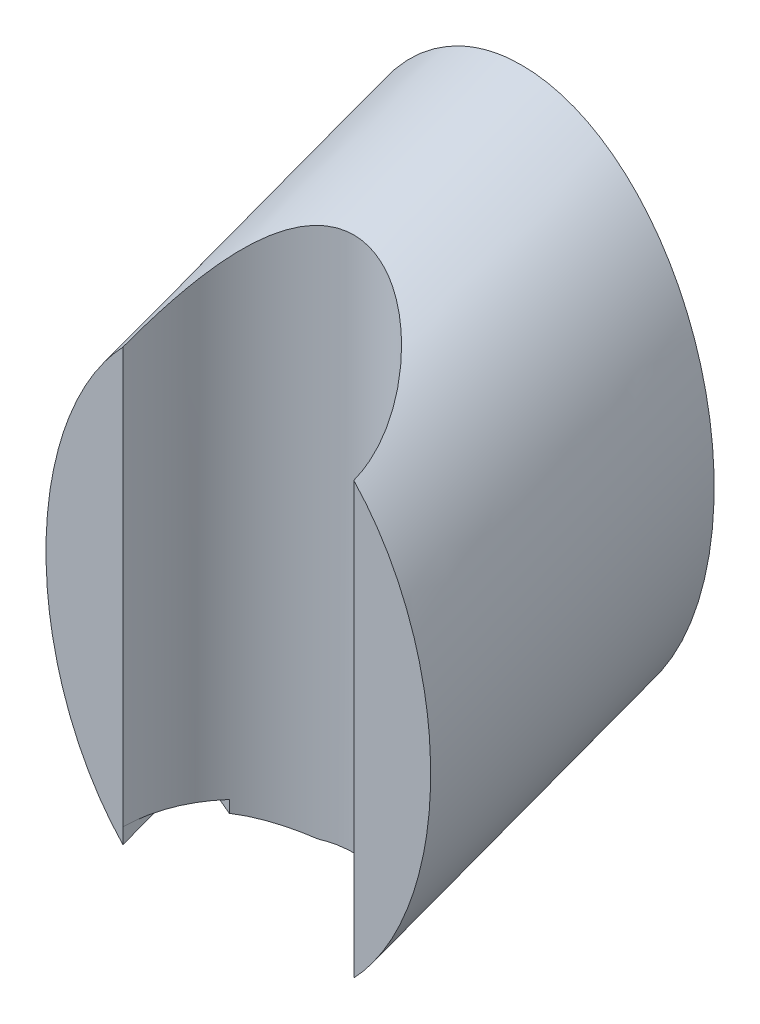
ISO-10303-21;
HEADER;
FILE_DESCRIPTION(('STEP AP214'),'2;1');
FILE_NAME('part.step','',(''),(''),'','','');
FILE_SCHEMA(('AUTOMOTIVE_DESIGN { 1 0 10303 214 1 1 1 1 }'));
ENDSEC;
DATA;
#1=APPLICATION_CONTEXT('core data for automotive mechanical design processes');
#2=APPLICATION_PROTOCOL_DEFINITION('international standard','automotive_design',2000,#1);
#3=PRODUCT_CONTEXT('',#1,'mechanical');
#4=PRODUCT('Part','Part','',(#3));
#5=PRODUCT_RELATED_PRODUCT_CATEGORY('part','',(#4));
#6=PRODUCT_DEFINITION_FORMATION('','',#4);
#7=PRODUCT_DEFINITION_CONTEXT('part definition',#1,'design');
#8=PRODUCT_DEFINITION('design','',#6,#7);
#9=PRODUCT_DEFINITION_SHAPE('','',#8);
#10=(LENGTH_UNIT() NAMED_UNIT(*) SI_UNIT(.MILLI.,.METRE.));
#11=(NAMED_UNIT(*) PLANE_ANGLE_UNIT() SI_UNIT($,.RADIAN.));
#12=(NAMED_UNIT(*) SI_UNIT($,.STERADIAN.) SOLID_ANGLE_UNIT());
#13=UNCERTAINTY_MEASURE_WITH_UNIT(LENGTH_MEASURE(1.E-05),#10,'distance_accuracy_value','');
#14=(GEOMETRIC_REPRESENTATION_CONTEXT(3) GLOBAL_UNCERTAINTY_ASSIGNED_CONTEXT((#13)) GLOBAL_UNIT_ASSIGNED_CONTEXT((#10,
#11,#12)) REPRESENTATION_CONTEXT('',''));
#15=CARTESIAN_POINT('',(0.,0.,0.));
#16=DIRECTION('',(0.,0.,1.));
#17=DIRECTION('',(1.,0.,0.));
#18=AXIS2_PLACEMENT_3D('',#15,#16,#17);
#19=CARTESIAN_POINT('',(0.,0.3,-0.8));
#20=DIRECTION('',(0.,0.,1.));
#21=DIRECTION('',(1.,0.,0.));
#22=AXIS2_PLACEMENT_3D('',#19,#20,#21);
#23=PLANE('',#22);
#24=CARTESIAN_POINT('',(0.,0.3,-0.8));
#25=DIRECTION('',(0.,0.,1.));
#26=DIRECTION('',(0.,1.,0.));
#27=AXIS2_PLACEMENT_3D('',#24,#25,#26);
#28=ELLIPSE('',#27,0.7,0.5);
#29=CARTESIAN_POINT('',(0.0814909660568855,-0.390640337660773,-0.8));
#30=VERTEX_POINT('',#29);
#31=CARTESIAN_POINT('',(-0.0814909660568858,-0.390640337660773,-0.8));
#32=VERTEX_POINT('',#31);
#33=EDGE_CURVE('E197',#30,#32,#28,.T.);
#34=ORIENTED_EDGE('',*,*,#33,.F.);
#35=DIRECTION('',(1.,0.,0.));
#36=VECTOR('',#35,1.);
#37=CARTESIAN_POINT('',(-0.0814909660568858,-0.390640337660773,-0.8));
#38=LINE('',#37,#36);
#39=EDGE_CURVE('E204',#32,#30,#38,.T.);
#40=ORIENTED_EDGE('',*,*,#39,.F.);
#41=EDGE_LOOP('',(#34,#40));
#42=FACE_BOUND('',#41,.T.);
#43=ADVANCED_FACE('F39',(#42),#23,.F.);
#44=CARTESIAN_POINT('',(0.0814909660568853,-0.690640337660773,0.));
#45=CARTESIAN_POINT('',(0.0814909660568853,-0.390640337660773,-0.8));
#46=CARTESIAN_POINT('',(0.92661392590139,-0.495191317308179,0.));
#47=CARTESIAN_POINT('',(0.92661392590139,-0.195191317308179,-0.8));
#48=CARTESIAN_POINT('',(0.856576194050407,0.7,0.));
#49=CARTESIAN_POINT('',(0.856576194050407,1.,-0.8));
#50=CARTESIAN_POINT('',(0.,0.7,0.));
#51=CARTESIAN_POINT('',(0.,1.,-0.8));
#52=CARTESIAN_POINT('',(-0.856576194050407,0.7,0.));
#53=CARTESIAN_POINT('',(-0.856576194050407,1.,-0.8));
#54=CARTESIAN_POINT('',(-0.92661392590139,-0.495191317308178,0.));
#55=CARTESIAN_POINT('',(-0.92661392590139,-0.195191317308178,-0.8));
#56=CARTESIAN_POINT('',(-0.0814909660568858,-0.690640337660773,0.));
#57=CARTESIAN_POINT('',(-0.0814909660568858,-0.390640337660773,-0.8));
#58=(BOUNDED_SURFACE() B_SPLINE_SURFACE(3,1,((#44,#45),(#46,#47),(#48,#49),(#50,#51),(#52,#53),
(#54,#55),(#56,#57)),.UNSPECIFIED.,.F.,.F.,.F.) B_SPLINE_SURFACE_WITH_KNOTS((4,3,4),(2,2),(0.,
0.5,1.),(0.,1.),.UNSPECIFIED.) GEOMETRIC_REPRESENTATION_ITEM() RATIONAL_B_SPLINE_SURFACE(((1.,
1.),(0.387843161598816,0.387843161598816),(0.387843161598816,0.387843161598816),(1.,1.),
(0.387843161598816,0.387843161598816),(0.387843161598816,0.387843161598816),(1.,1.))) REPRESENTATION_ITEM('') SURFACE());
#59=CARTESIAN_POINT('',(-0.263391346578015,-0.496250963693155,-0.263330757106771));
#60=CARTESIAN_POINT('',(-0.269996041138466,-0.496250963693165,-0.247972594877851));
#61=CARTESIAN_POINT('',(-0.276349109726996,-0.496250963693172,-0.232515735985668));
#62=CARTESIAN_POINT('',(-0.28855199496021,-0.496250963693179,-0.201404624874774));
#63=CARTESIAN_POINT('',(-0.294401811604895,-0.496250963693179,-0.185750372656064));
#64=CARTESIAN_POINT('',(-0.300000002277658,-0.496250963693175,-0.16999742377409));
#65=B_SPLINE_CURVE_WITH_KNOTS('',3,(#59,#60,#61,#62,#63,#64),.UNSPECIFIED.,.F.,.F.,(4,2,4),(0.,
0.050134655735637,0.100269311471274),.UNSPECIFIED.);
#66=CARTESIAN_POINT('',(-0.263391346578015,-0.496250963693175,-0.263330757106771));
#67=VERTEX_POINT('',#66);
#68=CARTESIAN_POINT('',(-0.300000002277658,-0.496250963693175,-0.169997423774091));
#69=VERTEX_POINT('',#68);
#70=EDGE_CURVE('E128',#67,#69,#65,.T.);
#71=DIRECTION('',(0.,0.351123441588392,-0.936329177569044));
#72=VECTOR('',#71,1.);
#73=CARTESIAN_POINT('',(-0.300000002277658,-0.398125480650949,-0.431665378553361));
#74=LINE('',#73,#72);
#75=CARTESIAN_POINT('',(-0.300000002277658,-0.536250963693175,-0.0633307571067715));
#76=VERTEX_POINT('',#75);
#77=EDGE_CURVE('E114',#69,#76,#74,.F.);
#78=CARTESIAN_POINT('',(-0.300000002277658,-0.536250963693419,-0.0633307571067715));
#79=CARTESIAN_POINT('',(-0.323025931439499,-0.512019826110842,-0.0633307571067715));
#80=CARTESIAN_POINT('',(-0.343833156643333,-0.485878502293997,-0.0633307571067715));
#81=CARTESIAN_POINT('',(-0.381159534785213,-0.430882562548173,-0.0633307571067715));
#82=CARTESIAN_POINT('',(-0.397701462397718,-0.40204352728876,-0.0633307571067715));
#83=CARTESIAN_POINT('',(-0.43323734246687,-0.329525523390162,-0.0633307571067715));
#84=CARTESIAN_POINT('',(-0.450170953919116,-0.284845525953756,-0.0633307571067715));
#85=CARTESIAN_POINT('',(-0.476683909762009,-0.193244230344888,-0.0633307571067715));
#86=CARTESIAN_POINT('',(-0.486236187145385,-0.146315347100564,-0.0633307571067715));
#87=CARTESIAN_POINT('',(-0.498392596441733,-0.0507122468150192,-0.0633307571067715));
#88=CARTESIAN_POINT('',(-0.500867337992046,-0.00202181063884479,-0.0633307571067715));
#89=CARTESIAN_POINT('',(-0.498600425708945,0.0951905601979872,-0.0633307571067715));
#90=CARTESIAN_POINT('',(-0.49385977749239,0.143712517395132,-0.0633307571067715));
#91=CARTESIAN_POINT('',(-0.477469464250361,0.236631691664326,-0.0633307571067715));
#92=CARTESIAN_POINT('',(-0.466244404913494,0.281103262215528,-0.0633307571067715));
#93=CARTESIAN_POINT('',(-0.436856675305315,0.367594093850563,-0.0633307571067715));
#94=CARTESIAN_POINT('',(-0.418719673509537,0.409621772959556,-0.0633307571067715));
#95=CARTESIAN_POINT('',(-0.383576946809093,0.473808155424523,-0.0633307571067715));
#96=CARTESIAN_POINT('',(-0.368944732904765,0.497267281144582,-0.0633307571067715));
#97=CARTESIAN_POINT('',(-0.336725422124075,0.54218746328864,-0.0633307571067715));
#98=CARTESIAN_POINT('',(-0.319126945912046,0.563640310633445,-0.0633307571067715));
#99=CARTESIAN_POINT('',(-0.300000002277659,0.583749031523497,-0.0633307571067715));
#100=B_SPLINE_CURVE_WITH_KNOTS('',3,(#78,#79,#80,#81,#82,#83,#84,#85,#86,#87,#88,#89,#90,#91,
#92,#93,#94,#95,#96,#97,#98,#99),.UNSPECIFIED.,.F.,.F.,(4,2,2,2,2,2,2,2,2,2,4),(0.,
0.0999384804332236,0.199331737360413,0.341934624801956,0.485057981020822,0.630781670572199,
0.776485052311334,0.913582736261401,1.05017617310471,1.13291321705319,1.21597520312181),.UNSPECIFIED.);
#101=CARTESIAN_POINT('',(-0.300000002277658,0.583749031523499,-0.0633307571067715));
#102=VERTEX_POINT('',#101);
#103=EDGE_CURVE('E126',#76,#102,#100,.T.);
#104=CARTESIAN_POINT('',(-0.300000002277658,0.583749031523499,-0.0633307571067715));
#105=CARTESIAN_POINT('',(-0.299972711575177,0.590276573500131,-0.0807496162031155));
#106=CARTESIAN_POINT('',(-0.298487325087446,0.598149501692409,-0.0974791809736354));
#107=CARTESIAN_POINT('',(-0.293088815638597,0.61566778737431,-0.129370329910315));
#108=CARTESIAN_POINT('',(-0.289199804402431,0.625294879900106,-0.144545762954461));
#109=CARTESIAN_POINT('',(-0.277778677594184,0.649072728772438,-0.178492378290257));
#110=CARTESIAN_POINT('',(-0.26945150953707,0.663635896626252,-0.196690110929112));
#111=CARTESIAN_POINT('',(-0.249618580137498,0.693339898328879,-0.230913690927232));
#112=CARTESIAN_POINT('',(-0.238094814248279,0.708483572655243,-0.246926446003193));
#113=CARTESIAN_POINT('',(-0.21398160126424,0.735731666543249,-0.274245371237357));
#114=CARTESIAN_POINT('',(-0.201882781790354,0.747924851505002,-0.285892054709489));
#115=CARTESIAN_POINT('',(-0.175321300974136,0.771131035181054,-0.307371072911569));
#116=CARTESIAN_POINT('',(-0.160868674589729,0.782148728957202,-0.317210748203136));
#117=CARTESIAN_POINT('',(-0.124355383358417,0.805171127735984,-0.337346308586147));
#118=CARTESIAN_POINT('',(-0.101317921829164,0.816455775368819,-0.346869702126861));
#119=CARTESIAN_POINT('',(-0.0659888438746828,0.827605516308709,-0.356184389430371));
#120=CARTESIAN_POINT('',(-0.0552128024736338,0.830297966721227,-0.358416766120046));
#121=CARTESIAN_POINT('',(-0.0332231150231734,0.834257263172539,-0.361691536202631));
#122=CARTESIAN_POINT('',(-0.0220098568108037,0.835525344225221,-0.36273496050012));
#123=CARTESIAN_POINT('',(0.000565208262681921,0.836507019726601,-0.363543204327845));
#124=CARTESIAN_POINT('',(0.0119273486136941,0.83621615129318,-0.36330435302079));
#125=CARTESIAN_POINT('',(0.034405758324311,0.834106515323748,-0.361565522360844));
#126=CARTESIAN_POINT('',(0.0455219087948928,0.832287024858874,-0.360064946302134));
#127=CARTESIAN_POINT('',(0.0772883870311435,0.824952639650819,-0.353980699609101));
#128=CARTESIAN_POINT('',(0.0972235002053322,0.81757561797425,-0.347828462571731));
#129=CARTESIAN_POINT('',(0.130499872265649,0.801314962706439,-0.333949533707399));
#130=CARTESIAN_POINT('',(0.144373297728302,0.792988241606348,-0.326748028357167));
#131=CARTESIAN_POINT('',(0.170259582097081,0.774991487033081,-0.310801089058831));
#132=CARTESIAN_POINT('',(0.182268866799873,0.765318938837563,-0.302052756328829));
#133=CARTESIAN_POINT('',(0.209409221725363,0.740806872878585,-0.279175101955125));
#134=CARTESIAN_POINT('',(0.223596582068502,0.725563038729862,-0.264369430682198));
#135=CARTESIAN_POINT('',(0.24864774116136,0.694783017729239,-0.232407329128613));
#136=CARTESIAN_POINT('',(0.259507661078848,0.679246511922665,-0.215248188846393));
#137=CARTESIAN_POINT('',(0.275318913153412,0.653210931931767,-0.183428001029982));
#138=CARTESIAN_POINT('',(0.281073905084292,0.642487156887064,-0.169349001541722));
#139=CARTESIAN_POINT('',(0.290514250540057,0.62218553886084,-0.139759712734384));
#140=CARTESIAN_POINT('',(0.294206381047666,0.612604025874106,-0.124254307380645));
#141=CARTESIAN_POINT('',(0.297730658508263,0.600197023383896,-0.100867170370894));
#142=CARTESIAN_POINT('',(0.298567320130883,0.596581336906294,-0.0935502127644584));
#143=CARTESIAN_POINT('',(0.299702977994772,0.589801203579505,-0.0786376243227117));
#144=CARTESIAN_POINT('',(0.299999946565062,0.586638499425727,-0.071041051497299));
#145=CARTESIAN_POINT('',(0.299999997722341,0.583749036306581,-0.0633307571067715));
#146=B_SPLINE_CURVE_WITH_KNOTS('',3,(#104,#105,#106,#107,#108,#109,#110,#111,#112,#113,#114,
#115,#116,#117,#118,#119,#120,#121,#122,#123,#124,#125,#126,#127,#128,#129,#130,#131,#132,#133,
#134,#135,#136,#137,#138,#139,#140,#141,#142,#143,#144,#145),.UNSPECIFIED.,.F.,.F.,(4,2,2,2,2,2,
2,2,2,2,2,2,2,2,2,2,2,2,2,2,4),(0.,0.0554398338411448,0.110332357743356,0.184224344412797,
0.25854128077065,0.320579815932228,0.382360472213098,0.462942960049244,0.496795861673506,
0.53061938808367,0.564539794409014,0.59847625169607,0.663874766099829,0.716781733457641,
0.769788921075761,0.84606435262269,0.922428363892432,0.978110680431297,1.0336089754184,
1.05819113271674,1.08286545775044),.UNSPECIFIED.);
#147=CARTESIAN_POINT('',(0.299999997722341,0.583749036306581,-0.0633307571067715));
#148=VERTEX_POINT('',#147);
#149=EDGE_CURVE('E189',#102,#148,#146,.T.);
#150=CARTESIAN_POINT('',(0.299999997722341,0.583749036306581,-0.0633307571067715));
#151=CARTESIAN_POINT('',(0.323025927183611,0.5595178989834,-0.0633307571067715));
#152=CARTESIAN_POINT('',(0.34383315267923,0.53337657537703,-0.0633307571067715));
#153=CARTESIAN_POINT('',(0.381159531381537,0.478380635982864,-0.0633307571067715));
#154=CARTESIAN_POINT('',(0.397701459263612,0.449541600865607,-0.0633307571067715));
#155=CARTESIAN_POINT('',(0.433237339814656,0.377023597563202,-0.0633307571067715));
#156=CARTESIAN_POINT('',(0.450170951527408,0.332343600583157,-0.0633307571067715));
#157=CARTESIAN_POINT('',(0.476683907968476,0.240742305841458,-0.0633307571067715));
#158=CARTESIAN_POINT('',(0.48623618568967,0.193813423007738,-0.0633307571067715));
#159=CARTESIAN_POINT('',(0.498392595756464,0.0982103234653977,-0.0633307571067715));
#160=CARTESIAN_POINT('',(0.500867337736011,0.0495198876202435,-0.0633307571067715));
#161=CARTESIAN_POINT('',(0.49860042640544,-0.0476924826265167,-0.0633307571067715));
#162=CARTESIAN_POINT('',(0.493859778711733,-0.0962144395645911,-0.0633307571067715));
#163=CARTESIAN_POINT('',(0.47746946646185,-0.189133614204064,-0.0633307571067715));
#164=CARTESIAN_POINT('',(0.466244407475617,-0.233605185358865,-0.0633307571067715));
#165=CARTESIAN_POINT('',(0.436856678452919,-0.320096018236228,-0.0633307571067715));
#166=CARTESIAN_POINT('',(0.418719676892396,-0.362123697983808,-0.0633307571067715));
#167=CARTESIAN_POINT('',(0.383576949493591,-0.426310083277006,-0.0633307571067715));
#168=CARTESIAN_POINT('',(0.368944734497272,-0.449769211063045,-0.0633307571067715));
#169=CARTESIAN_POINT('',(0.336725421030028,-0.494689397014993,-0.0633307571067715));
#170=CARTESIAN_POINT('',(0.319126943219278,-0.516142246098713,-0.0633307571067715));
#171=CARTESIAN_POINT('',(0.299999997722344,-0.536250968476499,-0.0633307571067715));
#172=B_SPLINE_CURVE_WITH_KNOTS('',3,(#150,#151,#152,#153,#154,#155,#156,#157,#158,#159,#160,
#161,#162,#163,#164,#165,#166,#167,#168,#169,#170,#171),.UNSPECIFIED.,.F.,.F.,(4,2,2,2,2,2,2,2,
2,2,4),(0.,0.0999384804784522,0.199331737430594,0.341934623874718,0.485057979094986,
0.630781667727766,0.776485048557148,0.913582733992146,1.05017617231517,1.13291322320269,
1.21597521630168),.UNSPECIFIED.);
#173=CARTESIAN_POINT('',(0.299999997722341,-0.536250968476502,-0.0633307571067715));
#174=VERTEX_POINT('',#173);
#175=EDGE_CURVE('E138',#148,#174,#172,.T.);
#176=DIRECTION('',(0.,0.351123441588392,-0.936329177569044));
#177=VECTOR('',#176,1.);
#178=CARTESIAN_POINT('',(0.299999997722341,-0.398125485434031,-0.431665378553361));
#179=LINE('',#178,#177);
#180=CARTESIAN_POINT('',(0.299999997722341,-0.496250963693175,-0.169997436528976));
#181=VERTEX_POINT('',#180);
#182=EDGE_CURVE('E329',#174,#181,#179,.T.);
#183=CARTESIAN_POINT('',(0.299999997722341,-0.496250963693175,-0.169997436528977));
#184=CARTESIAN_POINT('',(0.294401807682222,-0.496250963693175,-0.185750383237902));
#185=CARTESIAN_POINT('',(0.288551991733465,-0.496250963693175,-0.20140463330718));
#186=CARTESIAN_POINT('',(0.276349108018676,-0.496250963693175,-0.23251574016644));
#187=CARTESIAN_POINT('',(0.269996040252644,-0.496250963693175,-0.247972596956423));
#188=CARTESIAN_POINT('',(0.263391346577975,-0.496250963693175,-0.263330757106757));
#189=B_SPLINE_CURVE_WITH_KNOTS('',3,(#183,#184,#185,#186,#187,#188),.UNSPECIFIED.,.F.,.F.,(4,2,
4),(0.,0.0501346489644869,0.100269297928974),.UNSPECIFIED.);
#190=CARTESIAN_POINT('',(0.263391346578015,-0.496250963693175,-0.263330757106771));
#191=VERTEX_POINT('',#190);
#192=EDGE_CURVE('E131',#181,#191,#189,.T.);
#193=CARTESIAN_POINT('',(0.263391346578015,-0.496250963693155,-0.263330757106772));
#194=CARTESIAN_POINT('',(0.255023626958792,-0.503529906390884,-0.263330757106771));
#195=CARTESIAN_POINT('',(0.24642477229083,-0.510502711073083,-0.263330757106771));
#196=CARTESIAN_POINT('',(0.228764792857429,-0.523836044406423,-0.263330757106771));
#197=CARTESIAN_POINT('',(0.219703668091991,-0.530196573057564,-0.263330757106772));
#198=CARTESIAN_POINT('',(0.210411408277813,-0.536250963693176,-0.263330757106772));
#199=B_SPLINE_CURVE_WITH_KNOTS('',3,(#193,#194,#195,#196,#197,#198),.UNSPECIFIED.,.F.,.F.,(4,2,
4),(0.,0.0332120875681048,0.0664241751362098),.UNSPECIFIED.);
#200=CARTESIAN_POINT('',(0.22360679547232,-0.527350001379343,-0.263330757106771));
#201=VERTEX_POINT('',#200);
#202=EDGE_CURVE('E315',#191,#201,#199,.T.);
#203=CARTESIAN_POINT('',(0.299999997722341,-0.536250968476502,-0.0633307571067715));
#204=CARTESIAN_POINT('',(0.300000106689985,-0.533959350644493,-0.0694386594386586));
#205=CARTESIAN_POINT('',(0.299813177601952,-0.53184220787729,-0.0756108487702032));
#206=CARTESIAN_POINT('',(0.299044996495991,-0.52798245990409,-0.0880490714107));
#207=CARTESIAN_POINT('',(0.298463608547389,-0.52623998408114,-0.0943151363410693));
#208=CARTESIAN_POINT('',(0.296109011423495,-0.521637575192412,-0.113104135634102));
#209=CARTESIAN_POINT('',(0.293725913947501,-0.519368618517877,-0.12570775840319));
#210=CARTESIAN_POINT('',(0.287288773333346,-0.516431285979534,-0.150693295866269));
#211=CARTESIAN_POINT('',(0.283230922861353,-0.515766580906026,-0.163074637870691));
#212=CARTESIAN_POINT('',(0.273540513629309,-0.51581016956174,-0.187206113615354));
#213=CARTESIAN_POINT('',(0.267906120405548,-0.516520068510439,-0.198955492901219));
#214=CARTESIAN_POINT('',(0.253743271514194,-0.519234082833932,-0.224170186158249));
#215=CARTESIAN_POINT('',(0.244846497403076,-0.521500810428386,-0.237399011147745));
#216=CARTESIAN_POINT('',(0.225172489919545,-0.526868500771804,-0.26219969628157));
#217=CARTESIAN_POINT('',(0.214391662270535,-0.529971064315038,-0.27376831093797));
#218=CARTESIAN_POINT('',(0.191040492781805,-0.536445488904579,-0.295188135277828));
#219=CARTESIAN_POINT('',(0.178448538269935,-0.539820347828727,-0.305014834667875));
#220=CARTESIAN_POINT('',(0.151838191352007,-0.546273302173527,-0.322556528744454));
#221=CARTESIAN_POINT('',(0.137823136343255,-0.549352060398255,-0.330276314415848));
#222=CARTESIAN_POINT('',(0.109769824854525,-0.554610060878479,-0.342918916012431));
#223=CARTESIAN_POINT('',(0.095817396192805,-0.556840495293746,-0.348012022005726));
#224=CARTESIAN_POINT('',(0.0814909660568853,-0.558621314344304,-0.352050728843918));
#225=B_SPLINE_CURVE_WITH_KNOTS('',3,(#203,#204,#205,#206,#207,#208,#209,#210,#211,#212,#213,
#214,#215,#216,#217,#218,#219,#220,#221,#222,#223,#224),.UNSPECIFIED.,.F.,.F.,(4,2,2,2,2,2,2,2,
2,2,4),(0.,0.0195622286097096,0.0391312017969721,0.0779847234169177,0.116927064319053,
0.155914908292414,0.203970716948693,0.252119224633654,0.300899121088719,0.349567153126029,
0.39446669966179),.UNSPECIFIED.);
#226=CARTESIAN_POINT('',(0.0814909660568855,-0.558621314344304,-0.352050728843917));
#227=VERTEX_POINT('',#226);
#228=EDGE_CURVE('E118',#201,#227,#225,.T.);
#229=DIRECTION('',(0.,0.351123441588392,-0.936329177569044));
#230=VECTOR('',#229,1.);
#231=CARTESIAN_POINT('',(0.0814909660568855,-0.690640337660773,0.));
#232=LINE('',#231,#230);
#233=EDGE_CURVE('E196',#227,#30,#232,.T.);
#234=DIRECTION('',(0.,0.351123441588392,-0.936329177569044));
#235=VECTOR('',#234,1.);
#236=CARTESIAN_POINT('',(-0.0814909660568858,-0.690640337660773,0.));
#237=LINE('',#236,#235);
#238=CARTESIAN_POINT('',(-0.0814909660568858,-0.558621313862154,-0.352050730129652));
#239=VERTEX_POINT('',#238);
#240=EDGE_CURVE('E201',#239,#32,#237,.T.);
#241=CARTESIAN_POINT('',(-0.0814909660568858,-0.558621313862154,-0.352050730129652));
#242=CARTESIAN_POINT('',(-0.0978982465455354,-0.556588138500794,-0.347426156738039));
#243=CARTESIAN_POINT('',(-0.113805868479798,-0.553958558822974,-0.341421509020309));
#244=CARTESIAN_POINT('',(-0.144278629504612,-0.547993259147106,-0.326897088314947));
#245=CARTESIAN_POINT('',(-0.158844524721657,-0.544657940404295,-0.318378743434396));
#246=CARTESIAN_POINT('',(-0.186291411530036,-0.537769098815811,-0.299079253110658));
#247=CARTESIAN_POINT('',(-0.199174660900134,-0.534215877964508,-0.288301191455018));
#248=CARTESIAN_POINT('',(-0.223022643394734,-0.527521296791173,-0.264681141482256));
#249=CARTESIAN_POINT('',(-0.233988068687986,-0.524379787979715,-0.251839901018146));
#250=CARTESIAN_POINT('',(-0.251856319118007,-0.519756409512353,-0.22690853238696));
#251=CARTESIAN_POINT('',(-0.259135409980184,-0.518074171858283,-0.215125915214825));
#252=CARTESIAN_POINT('',(-0.272026044464474,-0.51596381664136,-0.190583115216087));
#253=CARTESIAN_POINT('',(-0.277640372036914,-0.515533594613446,-0.177824609821825));
#254=CARTESIAN_POINT('',(-0.287066452201532,-0.516346560333451,-0.151583586096276));
#255=CARTESIAN_POINT('',(-0.290863594795263,-0.517603011984055,-0.138096139000769));
#256=CARTESIAN_POINT('',(-0.296506103024615,-0.522022068086641,-0.111026976952086));
#257=CARTESIAN_POINT('',(-0.29835319900756,-0.525182978723649,-0.0974453563541565));
#258=CARTESIAN_POINT('',(-0.299523541639745,-0.530275772311085,-0.080596836150673));
#259=CARTESIAN_POINT('',(-0.29970338566202,-0.531393213797821,-0.0771145172829051));
#260=CARTESIAN_POINT('',(-0.299941324781611,-0.533739623473802,-0.0701922668339486));
#261=CARTESIAN_POINT('',(-0.299999696784183,-0.534968331329639,-0.0667522566568755));
#262=CARTESIAN_POINT('',(-0.300000002277909,-0.536250963693175,-0.0633307571067215));
#263=B_SPLINE_CURVE_WITH_KNOTS('',3,(#241,#242,#243,#244,#245,#246,#247,#248,#249,#250,#251,
#252,#253,#254,#255,#256,#257,#258,#259,#260,#261,#262),.UNSPECIFIED.,.F.,.F.,(4,2,2,2,2,2,2,2,
2,2,4),(0.,0.0513826589574417,0.102736181897073,0.154020074694077,0.205285420070615,
0.246977776737493,0.288600013728948,0.330551490373159,0.372465710577487,0.383448542794535,
0.394406311212004),.UNSPECIFIED.);
#264=CARTESIAN_POINT('',(-0.223606800027637,-0.527349998190772,-0.263330757106771));
#265=VERTEX_POINT('',#264);
#266=EDGE_CURVE('E63',#239,#265,#263,.T.);
#267=CARTESIAN_POINT('',(-0.210411408277814,-0.536250963693175,-0.263330757106771));
#268=CARTESIAN_POINT('',(-0.219703668091993,-0.530196573057566,-0.263330757106771));
#269=CARTESIAN_POINT('',(-0.228764792857432,-0.523836044406425,-0.263330757106771));
#270=CARTESIAN_POINT('',(-0.24642477229083,-0.51050271107308,-0.263330757106771));
#271=CARTESIAN_POINT('',(-0.255023626958788,-0.503529906390877,-0.263330757106771));
#272=CARTESIAN_POINT('',(-0.263391346578007,-0.496250963693142,-0.263330757106771));
#273=B_SPLINE_CURVE_WITH_KNOTS('',3,(#267,#268,#269,#270,#271,#272),.UNSPECIFIED.,.F.,.F.,(4,2,
4),(0.,0.0332120875681058,0.0664241751362115),.UNSPECIFIED.);
#274=EDGE_CURVE('E322',#265,#67,#273,.T.);
#275=ORIENTED_EDGE('',*,*,#70,.T.);
#276=ORIENTED_EDGE('',*,*,#77,.T.);
#277=ORIENTED_EDGE('',*,*,#103,.T.);
#278=ORIENTED_EDGE('',*,*,#149,.T.);
#279=ORIENTED_EDGE('',*,*,#175,.T.);
#280=ORIENTED_EDGE('',*,*,#182,.T.);
#281=ORIENTED_EDGE('',*,*,#192,.T.);
#282=ORIENTED_EDGE('',*,*,#202,.T.);
#283=ORIENTED_EDGE('',*,*,#228,.T.);
#284=ORIENTED_EDGE('',*,*,#233,.T.);
#285=ORIENTED_EDGE('',*,*,#33,.T.);
#286=ORIENTED_EDGE('',*,*,#240,.F.);
#287=ORIENTED_EDGE('',*,*,#266,.T.);
#288=ORIENTED_EDGE('',*,*,#274,.T.);
#289=EDGE_LOOP('',(#275,#276,#277,#278,#279,#280,#281,#282,#283,#284,#285,#286,#287,#288));
#290=FACE_BOUND('',#289,.T.);
#291=ADVANCED_FACE('F124',(#290),#58,.F.);
#292=CARTESIAN_POINT('',(-0.0814909660568858,-0.690640337660773,0.));
#293=DIRECTION('',(0.,0.936329177569045,0.351123441588392));
#294=DIRECTION('',(0.,-0.351123441588392,0.936329177569045));
#295=AXIS2_PLACEMENT_3D('',#292,#293,#294);
#296=PLANE('',#295);
#297=ORIENTED_EDGE('',*,*,#233,.F.);
#298=CARTESIAN_POINT('',(-2.27765847632053E-09,-0.666891303745734,-0.0633307571067715));
#299=DIRECTION('',(0.,0.936329177569045,0.351123441588392));
#300=DIRECTION('',(0.,0.351123441588392,-0.936329177569045));
#301=AXIS2_PLACEMENT_3D('',#298,#299,#300);
#302=ELLIPSE('',#301,0.320400140449407,0.3);
#303=EDGE_CURVE('E145',#227,#239,#302,.T.);
#304=ORIENTED_EDGE('',*,*,#303,.T.);
#305=ORIENTED_EDGE('',*,*,#240,.T.);
#306=ORIENTED_EDGE('',*,*,#39,.T.);
#307=EDGE_LOOP('',(#297,#304,#305,#306));
#308=FACE_BOUND('',#307,.T.);
#309=ADVANCED_FACE('F167',(#308),#296,.F.);
#310=CARTESIAN_POINT('',(-0.499999999524832,-0.690640337660773,-0.0633307571067715));
#311=DIRECTION('',(0.,0.,-1.));
#312=DIRECTION('',(-1.,0.,0.));
#313=AXIS2_PLACEMENT_3D('',#310,#311,#312);
#314=PLANE('',#313);
#315=DIRECTION('',(0.,1.,0.));
#316=VECTOR('',#315,1.);
#317=CARTESIAN_POINT('',(-0.300000002277658,-0.690640337660773,-0.0633307571067715));
#318=LINE('',#317,#316);
#319=CARTESIAN_POINT('',(-0.300000002277658,-0.496250963693175,-0.0633307571067715));
#320=VERTEX_POINT('',#319);
#321=EDGE_CURVE('E111',#76,#320,#318,.T.);
#322=ORIENTED_EDGE('',*,*,#321,.T.);
#323=EDGE_CURVE('E119',#320,#102,#318,.T.);
#324=ORIENTED_EDGE('',*,*,#323,.T.);
#325=ORIENTED_EDGE('',*,*,#103,.F.);
#326=EDGE_LOOP('',(#322,#324,#325));
#327=FACE_BOUND('',#326,.T.);
#328=ADVANCED_FACE('F133',(#327),#314,.F.);
#329=CARTESIAN_POINT('',(0.299999997722341,-0.690640337660773,-0.0633307571067715));
#330=DIRECTION('',(0.,0.,-1.));
#331=DIRECTION('',(-1.,0.,0.));
#332=AXIS2_PLACEMENT_3D('',#329,#330,#331);
#333=PLANE('',#332);
#334=DIRECTION('',(0.,1.,0.));
#335=VECTOR('',#334,1.);
#336=CARTESIAN_POINT('',(0.299999997722341,-0.690640337660773,-0.0633307571067715));
#337=LINE('',#336,#335);
#338=CARTESIAN_POINT('',(0.299999997722341,-0.496250963693175,-0.0633307571067715));
#339=VERTEX_POINT('',#338);
#340=EDGE_CURVE('E345',#174,#339,#337,.T.);
#341=ORIENTED_EDGE('',*,*,#340,.F.);
#342=ORIENTED_EDGE('',*,*,#175,.F.);
#343=EDGE_CURVE('E130',#339,#148,#337,.T.);
#344=ORIENTED_EDGE('',*,*,#343,.F.);
#345=EDGE_LOOP('',(#341,#342,#344));
#346=FACE_BOUND('',#345,.T.);
#347=ADVANCED_FACE('F166',(#346),#333,.F.);
#348=CARTESIAN_POINT('',(-2.27765847632053E-09,-0.690640337660773,-0.0633307571067715));
#349=DIRECTION('',(0.,1.,0.));
#350=DIRECTION('',(0.,0.,1.));
#351=AXIS2_PLACEMENT_3D('',#348,#349,#350);
#352=CYLINDRICAL_SURFACE('',#351,0.3);
#353=ORIENTED_EDGE('',*,*,#323,.F.);
#354=CARTESIAN_POINT('',(-2.27765847632053E-09,-0.496250963693175,-0.0633307571067715));
#355=DIRECTION('',(0.,1.,0.));
#356=DIRECTION('',(0.,0.,1.));
#357=AXIS2_PLACEMENT_3D('',#354,#355,#356);
#358=CIRCLE('',#357,0.3);
#359=CARTESIAN_POINT('',(-0.223606800027637,-0.496250963693175,-0.263330757106771));
#360=VERTEX_POINT('',#359);
#361=EDGE_CURVE('E11',#320,#360,#358,.F.);
#362=ORIENTED_EDGE('',*,*,#361,.T.);
#363=DIRECTION('',(0.,1.,0.));
#364=VECTOR('',#363,1.);
#365=CARTESIAN_POINT('',(-0.223606800027637,-0.690640337660773,-0.263330757106771));
#366=LINE('',#365,#364);
#367=EDGE_CURVE('E42',#360,#265,#366,.F.);
#368=ORIENTED_EDGE('',*,*,#367,.T.);
#369=ORIENTED_EDGE('',*,*,#266,.F.);
#370=ORIENTED_EDGE('',*,*,#303,.F.);
#371=ORIENTED_EDGE('',*,*,#228,.F.);
#372=DIRECTION('',(0.,1.,0.));
#373=VECTOR('',#372,1.);
#374=CARTESIAN_POINT('',(0.22360679547232,-0.690640337660773,-0.263330757106771));
#375=LINE('',#374,#373);
#376=CARTESIAN_POINT('',(0.223606795472321,-0.496250963693175,-0.263330757106771));
#377=VERTEX_POINT('',#376);
#378=EDGE_CURVE('E137',#201,#377,#375,.T.);
#379=ORIENTED_EDGE('',*,*,#378,.T.);
#380=EDGE_CURVE('E48',#377,#339,#358,.F.);
#381=ORIENTED_EDGE('',*,*,#380,.T.);
#382=ORIENTED_EDGE('',*,*,#343,.T.);
#383=ORIENTED_EDGE('',*,*,#149,.F.);
#384=EDGE_LOOP('',(#353,#362,#368,#369,#370,#371,#379,#381,#382,#383));
#385=FACE_BOUND('',#384,.T.);
#386=ADVANCED_FACE('F169',(#385),#352,.F.);
#387=CARTESIAN_POINT('',(0.,0.,-0.263330757106771));
#388=DIRECTION('',(0.,0.,-1.));
#389=DIRECTION('',(-1.,0.,0.));
#390=AXIS2_PLACEMENT_3D('',#387,#388,#389);
#391=PLANE('',#390);
#392=DIRECTION('',(-1.,0.,0.));
#393=VECTOR('',#392,1.);
#394=CARTESIAN_POINT('',(-0.300000002277658,-0.496250963693175,-0.263330757106771));
#395=LINE('',#394,#393);
#396=EDGE_CURVE('E358',#191,#377,#395,.T.);
#397=ORIENTED_EDGE('',*,*,#396,.T.);
#398=ORIENTED_EDGE('',*,*,#378,.F.);
#399=ORIENTED_EDGE('',*,*,#202,.F.);
#400=EDGE_LOOP('',(#397,#398,#399));
#401=FACE_BOUND('',#400,.T.);
#402=ADVANCED_FACE('F172',(#401),#391,.F.);
#403=CARTESIAN_POINT('',(0.299999997722341,-0.536250963693175,-0.263330757106771));
#404=DIRECTION('',(1.,0.,0.));
#405=DIRECTION('',(0.,0.,-1.));
#406=AXIS2_PLACEMENT_3D('',#403,#404,#405);
#407=PLANE('',#406);
#408=ORIENTED_EDGE('',*,*,#340,.T.);
#409=DIRECTION('',(0.,0.,1.));
#410=VECTOR('',#409,1.);
#411=CARTESIAN_POINT('',(0.299999997722341,-0.496250963693175,-0.263330757106771));
#412=LINE('',#411,#410);
#413=EDGE_CURVE('E356',#181,#339,#412,.T.);
#414=ORIENTED_EDGE('',*,*,#413,.F.);
#415=ORIENTED_EDGE('',*,*,#182,.F.);
#416=EDGE_LOOP('',(#408,#414,#415));
#417=FACE_BOUND('',#416,.T.);
#418=ADVANCED_FACE('F246',(#417),#407,.F.);
#419=CARTESIAN_POINT('',(-0.300000002277658,-0.496250963693175,-0.263330757106771));
#420=DIRECTION('',(0.,1.,0.));
#421=DIRECTION('',(0.,0.,1.));
#422=AXIS2_PLACEMENT_3D('',#419,#420,#421);
#423=PLANE('',#422);
#424=ORIENTED_EDGE('',*,*,#413,.T.);
#425=ORIENTED_EDGE('',*,*,#380,.F.);
#426=ORIENTED_EDGE('',*,*,#396,.F.);
#427=ORIENTED_EDGE('',*,*,#192,.F.);
#428=EDGE_LOOP('',(#424,#425,#426,#427));
#429=FACE_BOUND('',#428,.T.);
#430=ADVANCED_FACE('F255',(#429),#423,.F.);
#431=CARTESIAN_POINT('',(-0.300000002277658,-0.536250963693175,-0.263330757106771));
#432=DIRECTION('',(-1.,0.,0.));
#433=DIRECTION('',(0.,0.,1.));
#434=AXIS2_PLACEMENT_3D('',#431,#432,#433);
#435=PLANE('',#434);
#436=DIRECTION('',(0.,0.,1.));
#437=VECTOR('',#436,1.);
#438=CARTESIAN_POINT('',(-0.300000002277658,-0.496250963693175,-0.263330757106771));
#439=LINE('',#438,#437);
#440=EDGE_CURVE('E55',#69,#320,#439,.T.);
#441=ORIENTED_EDGE('',*,*,#440,.T.);
#442=ORIENTED_EDGE('',*,*,#321,.F.);
#443=ORIENTED_EDGE('',*,*,#77,.F.);
#444=EDGE_LOOP('',(#441,#442,#443));
#445=FACE_BOUND('',#444,.T.);
#446=ADVANCED_FACE('F113',(#445),#435,.F.);
#447=EDGE_CURVE('E363',#360,#67,#395,.T.);
#448=ORIENTED_EDGE('',*,*,#447,.F.);
#449=ORIENTED_EDGE('',*,*,#361,.F.);
#450=ORIENTED_EDGE('',*,*,#440,.F.);
#451=ORIENTED_EDGE('',*,*,#70,.F.);
#452=EDGE_LOOP('',(#448,#449,#450,#451));
#453=FACE_BOUND('',#452,.T.);
#454=ADVANCED_FACE('F264',(#453),#423,.F.);
#455=ORIENTED_EDGE('',*,*,#367,.F.);
#456=ORIENTED_EDGE('',*,*,#447,.T.);
#457=ORIENTED_EDGE('',*,*,#274,.F.);
#458=EDGE_LOOP('',(#455,#456,#457));
#459=FACE_BOUND('',#458,.T.);
#460=ADVANCED_FACE('F249',(#459),#391,.F.);
#461=CLOSED_SHELL('',(#43,#291,#309,#328,#347,#386,#402,#418,#430,#446,#454,#460));
#462=MANIFOLD_SOLID_BREP('B2',#461);
#463=ADVANCED_BREP_SHAPE_REPRESENTATION('',(#18,#462),#14);
#464=SHAPE_DEFINITION_REPRESENTATION(#9,#463);
ENDSEC;
END-ISO-10303-21;
